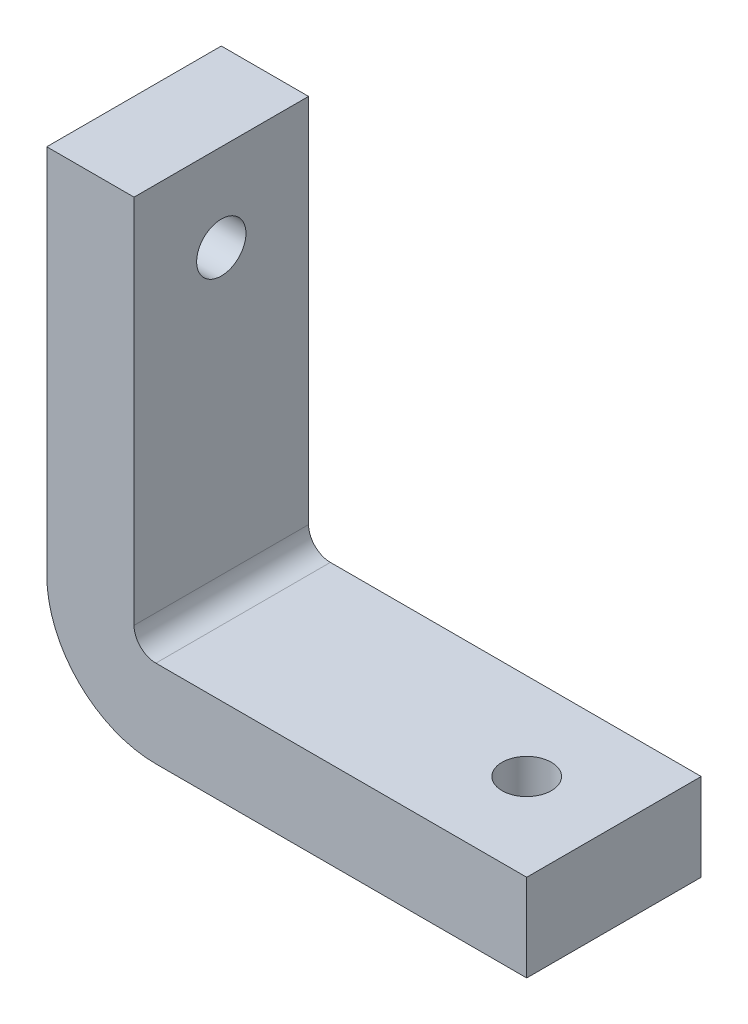
ISO-10303-21;
HEADER;
FILE_DESCRIPTION(('STEP AP214'),'2;1');
FILE_NAME('part.step','',(''),(''),'','','');
FILE_SCHEMA(('AUTOMOTIVE_DESIGN { 1 0 10303 214 1 1 1 1 }'));
ENDSEC;
DATA;
#1=APPLICATION_CONTEXT('core data for automotive mechanical design processes');
#2=APPLICATION_PROTOCOL_DEFINITION('international standard','automotive_design',2000,#1);
#3=PRODUCT_CONTEXT('',#1,'mechanical');
#4=PRODUCT('Part','Part','',(#3));
#5=PRODUCT_RELATED_PRODUCT_CATEGORY('part','',(#4));
#6=PRODUCT_DEFINITION_FORMATION('','',#4);
#7=PRODUCT_DEFINITION_CONTEXT('part definition',#1,'design');
#8=PRODUCT_DEFINITION('design','',#6,#7);
#9=PRODUCT_DEFINITION_SHAPE('','',#8);
#10=(LENGTH_UNIT() NAMED_UNIT(*) SI_UNIT(.MILLI.,.METRE.));
#11=(NAMED_UNIT(*) PLANE_ANGLE_UNIT() SI_UNIT($,.RADIAN.));
#12=(NAMED_UNIT(*) SI_UNIT($,.STERADIAN.) SOLID_ANGLE_UNIT());
#13=UNCERTAINTY_MEASURE_WITH_UNIT(LENGTH_MEASURE(1.E-05),#10,'distance_accuracy_value','');
#14=(GEOMETRIC_REPRESENTATION_CONTEXT(3) GLOBAL_UNCERTAINTY_ASSIGNED_CONTEXT((#13)) GLOBAL_UNIT_ASSIGNED_CONTEXT((#10,
#11,#12)) REPRESENTATION_CONTEXT('',''));
#15=CARTESIAN_POINT('',(0.,0.,0.));
#16=DIRECTION('',(0.,0.,1.));
#17=DIRECTION('',(1.,0.,0.));
#18=AXIS2_PLACEMENT_3D('',#15,#16,#17);
#19=CARTESIAN_POINT('',(18.,0.,4.));
#20=DIRECTION('',(-1.,0.,0.));
#21=DIRECTION('',(0.,0.,1.));
#22=AXIS2_PLACEMENT_3D('',#19,#20,#21);
#23=PLANE('',#22);
#24=DIRECTION('',(0.,1.,0.));
#25=VECTOR('',#24,1.);
#26=CARTESIAN_POINT('',(18.,0.,-4.));
#27=LINE('',#26,#25);
#28=CARTESIAN_POINT('',(18.,-4.,-4.));
#29=VERTEX_POINT('',#28);
#30=CARTESIAN_POINT('',(18.,0.,-4.));
#31=VERTEX_POINT('',#30);
#32=EDGE_CURVE('E135',#29,#31,#27,.T.);
#33=ORIENTED_EDGE('',*,*,#32,.T.);
#34=DIRECTION('',(0.,0.,-1.));
#35=VECTOR('',#34,1.);
#36=CARTESIAN_POINT('',(18.,0.,4.));
#37=LINE('',#36,#35);
#38=CARTESIAN_POINT('',(18.,0.,4.));
#39=VERTEX_POINT('',#38);
#40=EDGE_CURVE('E11',#39,#31,#37,.T.);
#41=ORIENTED_EDGE('',*,*,#40,.F.);
#42=DIRECTION('',(0.,1.,0.));
#43=VECTOR('',#42,1.);
#44=CARTESIAN_POINT('',(18.,0.,4.));
#45=LINE('',#44,#43);
#46=CARTESIAN_POINT('',(18.,-4.,4.));
#47=VERTEX_POINT('',#46);
#48=EDGE_CURVE('E149',#47,#39,#45,.T.);
#49=ORIENTED_EDGE('',*,*,#48,.F.);
#50=DIRECTION('',(0.,0.,-1.));
#51=VECTOR('',#50,1.);
#52=CARTESIAN_POINT('',(18.,-4.,4.));
#53=LINE('',#52,#51);
#54=EDGE_CURVE('E131',#47,#29,#53,.T.);
#55=ORIENTED_EDGE('',*,*,#54,.T.);
#56=EDGE_LOOP('',(#33,#41,#49,#55));
#57=FACE_BOUND('',#56,.T.);
#58=ADVANCED_FACE('F38',(#57),#23,.F.);
#59=CARTESIAN_POINT('',(1.00000000000001,0.,4.));
#60=DIRECTION('',(0.,-1.,0.));
#61=DIRECTION('',(0.,0.,-1.));
#62=AXIS2_PLACEMENT_3D('',#59,#60,#61);
#63=PLANE('',#62);
#64=CARTESIAN_POINT('',(14.,0.,0.));
#65=DIRECTION('',(0.,1.,0.));
#66=DIRECTION('',(0.,0.,1.));
#67=AXIS2_PLACEMENT_3D('',#64,#65,#66);
#68=CIRCLE('',#67,1.1303);
#69=CARTESIAN_POINT('',(14.,0.,1.1303));
#70=VERTEX_POINT('',#69);
#71=EDGE_CURVE('E189',#70,#70,#68,.T.);
#72=ORIENTED_EDGE('',*,*,#71,.F.);
#73=EDGE_LOOP('',(#72));
#74=FACE_BOUND('',#73,.T.);
#75=DIRECTION('',(-1.,0.,0.));
#76=VECTOR('',#75,1.);
#77=CARTESIAN_POINT('',(1.00000000000001,0.,-4.));
#78=LINE('',#77,#76);
#79=CARTESIAN_POINT('',(1.00000000000001,0.,-4.));
#80=VERTEX_POINT('',#79);
#81=EDGE_CURVE('E138',#31,#80,#78,.T.);
#82=ORIENTED_EDGE('',*,*,#81,.T.);
#83=DIRECTION('',(0.,0.,-1.));
#84=VECTOR('',#83,1.);
#85=CARTESIAN_POINT('',(1.00000000000001,0.,4.));
#86=LINE('',#85,#84);
#87=CARTESIAN_POINT('',(1.00000000000001,0.,4.));
#88=VERTEX_POINT('',#87);
#89=EDGE_CURVE('E47',#88,#80,#86,.T.);
#90=ORIENTED_EDGE('',*,*,#89,.F.);
#91=DIRECTION('',(-1.,0.,0.));
#92=VECTOR('',#91,1.);
#93=CARTESIAN_POINT('',(1.00000000000001,0.,4.));
#94=LINE('',#93,#92);
#95=EDGE_CURVE('E98',#39,#88,#94,.T.);
#96=ORIENTED_EDGE('',*,*,#95,.F.);
#97=ORIENTED_EDGE('',*,*,#40,.T.);
#98=EDGE_LOOP('',(#82,#90,#96,#97));
#99=FACE_BOUND('',#98,.T.);
#100=ADVANCED_FACE('F196',(#74,#99),#63,.F.);
#101=CARTESIAN_POINT('',(1.,1.,4.));
#102=DIRECTION('',(0.,0.,-1.));
#103=DIRECTION('',(-1.,0.,0.));
#104=AXIS2_PLACEMENT_3D('',#101,#102,#103);
#105=CYLINDRICAL_SURFACE('',#104,1.);
#106=CARTESIAN_POINT('',(1.,1.,-4.));
#107=DIRECTION('',(0.,0.,-1.));
#108=DIRECTION('',(-1.,0.,0.));
#109=AXIS2_PLACEMENT_3D('',#106,#107,#108);
#110=CIRCLE('',#109,1.);
#111=CARTESIAN_POINT('',(0.,1.,-4.));
#112=VERTEX_POINT('',#111);
#113=EDGE_CURVE('E140',#80,#112,#110,.T.);
#114=ORIENTED_EDGE('',*,*,#113,.T.);
#115=DIRECTION('',(0.,0.,-1.));
#116=VECTOR('',#115,1.);
#117=CARTESIAN_POINT('',(0.,1.,4.));
#118=LINE('',#117,#116);
#119=CARTESIAN_POINT('',(0.,1.,4.));
#120=VERTEX_POINT('',#119);
#121=EDGE_CURVE('E156',#120,#112,#118,.T.);
#122=ORIENTED_EDGE('',*,*,#121,.F.);
#123=CARTESIAN_POINT('',(1.,1.,4.));
#124=DIRECTION('',(0.,0.,-1.));
#125=DIRECTION('',(-1.,0.,0.));
#126=AXIS2_PLACEMENT_3D('',#123,#124,#125);
#127=CIRCLE('',#126,1.);
#128=EDGE_CURVE('E165',#88,#120,#127,.T.);
#129=ORIENTED_EDGE('',*,*,#128,.F.);
#130=ORIENTED_EDGE('',*,*,#89,.T.);
#131=EDGE_LOOP('',(#114,#122,#129,#130));
#132=FACE_BOUND('',#131,.T.);
#133=ADVANCED_FACE('F163',(#132),#105,.F.);
#134=CARTESIAN_POINT('',(0.,1.00000000000001,4.));
#135=DIRECTION('',(-1.,0.,0.));
#136=DIRECTION('',(0.,0.,1.));
#137=AXIS2_PLACEMENT_3D('',#134,#135,#136);
#138=PLANE('',#137);
#139=CARTESIAN_POINT('',(0.,14.,0.));
#140=DIRECTION('',(1.,0.,0.));
#141=DIRECTION('',(0.,0.,-1.));
#142=AXIS2_PLACEMENT_3D('',#139,#140,#141);
#143=CIRCLE('',#142,1.1303);
#144=CARTESIAN_POINT('',(0.,14.,-1.1303));
#145=VERTEX_POINT('',#144);
#146=EDGE_CURVE('E183',#145,#145,#143,.T.);
#147=ORIENTED_EDGE('',*,*,#146,.F.);
#148=EDGE_LOOP('',(#147));
#149=FACE_BOUND('',#148,.T.);
#150=DIRECTION('',(0.,1.,0.));
#151=VECTOR('',#150,1.);
#152=CARTESIAN_POINT('',(0.,1.00000000000001,-4.));
#153=LINE('',#152,#151);
#154=CARTESIAN_POINT('',(0.,18.,-4.));
#155=VERTEX_POINT('',#154);
#156=EDGE_CURVE('E142',#112,#155,#153,.T.);
#157=ORIENTED_EDGE('',*,*,#156,.T.);
#158=DIRECTION('',(0.,0.,-1.));
#159=VECTOR('',#158,1.);
#160=CARTESIAN_POINT('',(0.,18.,4.));
#161=LINE('',#160,#159);
#162=CARTESIAN_POINT('',(0.,18.,4.));
#163=VERTEX_POINT('',#162);
#164=EDGE_CURVE('E153',#163,#155,#161,.T.);
#165=ORIENTED_EDGE('',*,*,#164,.F.);
#166=DIRECTION('',(0.,1.,0.));
#167=VECTOR('',#166,1.);
#168=CARTESIAN_POINT('',(0.,1.00000000000001,4.));
#169=LINE('',#168,#167);
#170=EDGE_CURVE('E177',#120,#163,#169,.T.);
#171=ORIENTED_EDGE('',*,*,#170,.F.);
#172=ORIENTED_EDGE('',*,*,#121,.T.);
#173=EDGE_LOOP('',(#157,#165,#171,#172));
#174=FACE_BOUND('',#173,.T.);
#175=ADVANCED_FACE('F173',(#149,#174),#138,.F.);
#176=CARTESIAN_POINT('',(0.,18.,4.));
#177=DIRECTION('',(0.,-1.,0.));
#178=DIRECTION('',(0.,0.,-1.));
#179=AXIS2_PLACEMENT_3D('',#176,#177,#178);
#180=PLANE('',#179);
#181=DIRECTION('',(-1.,0.,0.));
#182=VECTOR('',#181,1.);
#183=CARTESIAN_POINT('',(0.,18.,-4.));
#184=LINE('',#183,#182);
#185=CARTESIAN_POINT('',(-4.,18.,-4.));
#186=VERTEX_POINT('',#185);
#187=EDGE_CURVE('E144',#155,#186,#184,.T.);
#188=ORIENTED_EDGE('',*,*,#187,.T.);
#189=DIRECTION('',(0.,0.,-1.));
#190=VECTOR('',#189,1.);
#191=CARTESIAN_POINT('',(-4.,18.,4.));
#192=LINE('',#191,#190);
#193=CARTESIAN_POINT('',(-4.,18.,4.));
#194=VERTEX_POINT('',#193);
#195=EDGE_CURVE('E126',#194,#186,#192,.T.);
#196=ORIENTED_EDGE('',*,*,#195,.F.);
#197=DIRECTION('',(-1.,0.,0.));
#198=VECTOR('',#197,1.);
#199=CARTESIAN_POINT('',(0.,18.,4.));
#200=LINE('',#199,#198);
#201=EDGE_CURVE('E117',#163,#194,#200,.T.);
#202=ORIENTED_EDGE('',*,*,#201,.F.);
#203=ORIENTED_EDGE('',*,*,#164,.T.);
#204=EDGE_LOOP('',(#188,#196,#202,#203));
#205=FACE_BOUND('',#204,.T.);
#206=ADVANCED_FACE('F176',(#205),#180,.F.);
#207=CARTESIAN_POINT('',(-4.,1.,4.));
#208=DIRECTION('',(1.,0.,0.));
#209=DIRECTION('',(0.,0.,-1.));
#210=AXIS2_PLACEMENT_3D('',#207,#208,#209);
#211=PLANE('',#210);
#212=CARTESIAN_POINT('',(-4.,14.,0.));
#213=DIRECTION('',(1.,0.,0.));
#214=DIRECTION('',(0.,0.,-1.));
#215=AXIS2_PLACEMENT_3D('',#212,#213,#214);
#216=CIRCLE('',#215,1.1303);
#217=CARTESIAN_POINT('',(-4.,14.,-1.1303));
#218=VERTEX_POINT('',#217);
#219=EDGE_CURVE('E41',#218,#218,#216,.T.);
#220=ORIENTED_EDGE('',*,*,#219,.T.);
#221=EDGE_LOOP('',(#220));
#222=FACE_BOUND('',#221,.T.);
#223=DIRECTION('',(0.,-1.,0.));
#224=VECTOR('',#223,1.);
#225=CARTESIAN_POINT('',(-4.,1.,-4.));
#226=LINE('',#225,#224);
#227=CARTESIAN_POINT('',(-4.,1.,-4.));
#228=VERTEX_POINT('',#227);
#229=EDGE_CURVE('E125',#186,#228,#226,.T.);
#230=ORIENTED_EDGE('',*,*,#229,.T.);
#231=DIRECTION('',(0.,0.,-1.));
#232=VECTOR('',#231,1.);
#233=CARTESIAN_POINT('',(-4.,1.,4.));
#234=LINE('',#233,#232);
#235=CARTESIAN_POINT('',(-4.,1.,4.));
#236=VERTEX_POINT('',#235);
#237=EDGE_CURVE('E122',#236,#228,#234,.T.);
#238=ORIENTED_EDGE('',*,*,#237,.F.);
#239=DIRECTION('',(0.,-1.,0.));
#240=VECTOR('',#239,1.);
#241=CARTESIAN_POINT('',(-4.,1.,4.));
#242=LINE('',#241,#240);
#243=EDGE_CURVE('E111',#194,#236,#242,.T.);
#244=ORIENTED_EDGE('',*,*,#243,.F.);
#245=ORIENTED_EDGE('',*,*,#195,.T.);
#246=EDGE_LOOP('',(#230,#238,#244,#245));
#247=FACE_BOUND('',#246,.T.);
#248=ADVANCED_FACE('F123',(#222,#247),#211,.F.);
#249=CARTESIAN_POINT('',(1.,1.,4.));
#250=DIRECTION('',(0.,0.,-1.));
#251=DIRECTION('',(-1.,0.,0.));
#252=AXIS2_PLACEMENT_3D('',#249,#250,#251);
#253=CYLINDRICAL_SURFACE('',#252,5.);
#254=CARTESIAN_POINT('',(1.,1.,-4.));
#255=DIRECTION('',(0.,0.,1.));
#256=DIRECTION('',(-1.,0.,0.));
#257=AXIS2_PLACEMENT_3D('',#254,#255,#256);
#258=CIRCLE('',#257,5.);
#259=CARTESIAN_POINT('',(1.00000000000007,-4.,-4.));
#260=VERTEX_POINT('',#259);
#261=EDGE_CURVE('E84',#228,#260,#258,.T.);
#262=ORIENTED_EDGE('',*,*,#261,.T.);
#263=DIRECTION('',(0.,0.,-1.));
#264=VECTOR('',#263,1.);
#265=CARTESIAN_POINT('',(1.00000000000007,-4.,4.));
#266=LINE('',#265,#264);
#267=CARTESIAN_POINT('',(1.00000000000007,-4.,4.));
#268=VERTEX_POINT('',#267);
#269=EDGE_CURVE('E127',#268,#260,#266,.T.);
#270=ORIENTED_EDGE('',*,*,#269,.F.);
#271=CARTESIAN_POINT('',(1.,1.,4.));
#272=DIRECTION('',(0.,0.,1.));
#273=DIRECTION('',(-1.,0.,0.));
#274=AXIS2_PLACEMENT_3D('',#271,#272,#273);
#275=CIRCLE('',#274,5.);
#276=EDGE_CURVE('E115',#236,#268,#275,.T.);
#277=ORIENTED_EDGE('',*,*,#276,.F.);
#278=ORIENTED_EDGE('',*,*,#237,.T.);
#279=EDGE_LOOP('',(#262,#270,#277,#278));
#280=FACE_BOUND('',#279,.T.);
#281=ADVANCED_FACE('F129',(#280),#253,.T.);
#282=CARTESIAN_POINT('',(1.00000000000007,-4.,4.));
#283=DIRECTION('',(0.,1.,0.));
#284=DIRECTION('',(0.,0.,1.));
#285=AXIS2_PLACEMENT_3D('',#282,#283,#284);
#286=PLANE('',#285);
#287=CARTESIAN_POINT('',(14.,-4.,0.));
#288=DIRECTION('',(0.,1.,0.));
#289=DIRECTION('',(0.,0.,1.));
#290=AXIS2_PLACEMENT_3D('',#287,#288,#289);
#291=CIRCLE('',#290,1.1303);
#292=CARTESIAN_POINT('',(14.,-4.,1.1303));
#293=VERTEX_POINT('',#292);
#294=EDGE_CURVE('E186',#293,#293,#291,.T.);
#295=ORIENTED_EDGE('',*,*,#294,.T.);
#296=EDGE_LOOP('',(#295));
#297=FACE_BOUND('',#296,.T.);
#298=DIRECTION('',(1.,0.,0.));
#299=VECTOR('',#298,1.);
#300=CARTESIAN_POINT('',(1.00000000000007,-4.,-4.));
#301=LINE('',#300,#299);
#302=EDGE_CURVE('E90',#260,#29,#301,.T.);
#303=ORIENTED_EDGE('',*,*,#302,.T.);
#304=ORIENTED_EDGE('',*,*,#54,.F.);
#305=DIRECTION('',(1.,0.,0.));
#306=VECTOR('',#305,1.);
#307=CARTESIAN_POINT('',(1.00000000000007,-4.,4.));
#308=LINE('',#307,#306);
#309=EDGE_CURVE('E55',#268,#47,#308,.T.);
#310=ORIENTED_EDGE('',*,*,#309,.F.);
#311=ORIENTED_EDGE('',*,*,#269,.T.);
#312=EDGE_LOOP('',(#303,#304,#310,#311));
#313=FACE_BOUND('',#312,.T.);
#314=ADVANCED_FACE('F201',(#297,#313),#286,.F.);
#315=CARTESIAN_POINT('',(1.,1.,4.));
#316=DIRECTION('',(0.,0.,-1.));
#317=DIRECTION('',(-1.,0.,0.));
#318=AXIS2_PLACEMENT_3D('',#315,#316,#317);
#319=PLANE('',#318);
#320=ORIENTED_EDGE('',*,*,#48,.T.);
#321=ORIENTED_EDGE('',*,*,#95,.T.);
#322=ORIENTED_EDGE('',*,*,#128,.T.);
#323=ORIENTED_EDGE('',*,*,#170,.T.);
#324=ORIENTED_EDGE('',*,*,#201,.T.);
#325=ORIENTED_EDGE('',*,*,#243,.T.);
#326=ORIENTED_EDGE('',*,*,#276,.T.);
#327=ORIENTED_EDGE('',*,*,#309,.T.);
#328=EDGE_LOOP('',(#320,#321,#322,#323,#324,#325,#326,#327));
#329=FACE_BOUND('',#328,.T.);
#330=ADVANCED_FACE('F113',(#329),#319,.F.);
#331=CARTESIAN_POINT('',(1.,1.,-4.));
#332=DIRECTION('',(0.,0.,-1.));
#333=DIRECTION('',(-1.,0.,0.));
#334=AXIS2_PLACEMENT_3D('',#331,#332,#333);
#335=PLANE('',#334);
#336=ORIENTED_EDGE('',*,*,#32,.F.);
#337=ORIENTED_EDGE('',*,*,#302,.F.);
#338=ORIENTED_EDGE('',*,*,#261,.F.);
#339=ORIENTED_EDGE('',*,*,#229,.F.);
#340=ORIENTED_EDGE('',*,*,#187,.F.);
#341=ORIENTED_EDGE('',*,*,#156,.F.);
#342=ORIENTED_EDGE('',*,*,#113,.F.);
#343=ORIENTED_EDGE('',*,*,#81,.F.);
#344=EDGE_LOOP('',(#336,#337,#338,#339,#340,#341,#342,#343));
#345=FACE_BOUND('',#344,.T.);
#346=ADVANCED_FACE('F169',(#345),#335,.T.);
#347=CARTESIAN_POINT('',(0.,14.,0.));
#348=DIRECTION('',(1.,0.,0.));
#349=DIRECTION('',(0.,0.,-1.));
#350=AXIS2_PLACEMENT_3D('',#347,#348,#349);
#351=CYLINDRICAL_SURFACE('',#350,1.1303);
#352=ORIENTED_EDGE('',*,*,#146,.T.);
#353=EDGE_LOOP('',(#352));
#354=FACE_BOUND('',#353,.T.);
#355=ORIENTED_EDGE('',*,*,#219,.F.);
#356=EDGE_LOOP('',(#355));
#357=FACE_BOUND('',#356,.T.);
#358=ADVANCED_FACE('F267',(#354,#357),#351,.F.);
#359=CARTESIAN_POINT('',(14.,0.,0.));
#360=DIRECTION('',(0.,1.,0.));
#361=DIRECTION('',(0.,0.,1.));
#362=AXIS2_PLACEMENT_3D('',#359,#360,#361);
#363=CYLINDRICAL_SURFACE('',#362,1.1303);
#364=ORIENTED_EDGE('',*,*,#71,.T.);
#365=EDGE_LOOP('',(#364));
#366=FACE_BOUND('',#365,.T.);
#367=ORIENTED_EDGE('',*,*,#294,.F.);
#368=EDGE_LOOP('',(#367));
#369=FACE_BOUND('',#368,.T.);
#370=ADVANCED_FACE('F193',(#366,#369),#363,.F.);
#371=CLOSED_SHELL('',(#58,#100,#133,#175,#206,#248,#281,#314,#330,#346,#358,#370));
#372=MANIFOLD_SOLID_BREP('B2',#371);
#373=ADVANCED_BREP_SHAPE_REPRESENTATION('',(#18,#372),#14);
#374=SHAPE_DEFINITION_REPRESENTATION(#9,#373);
ENDSEC;
END-ISO-10303-21;
